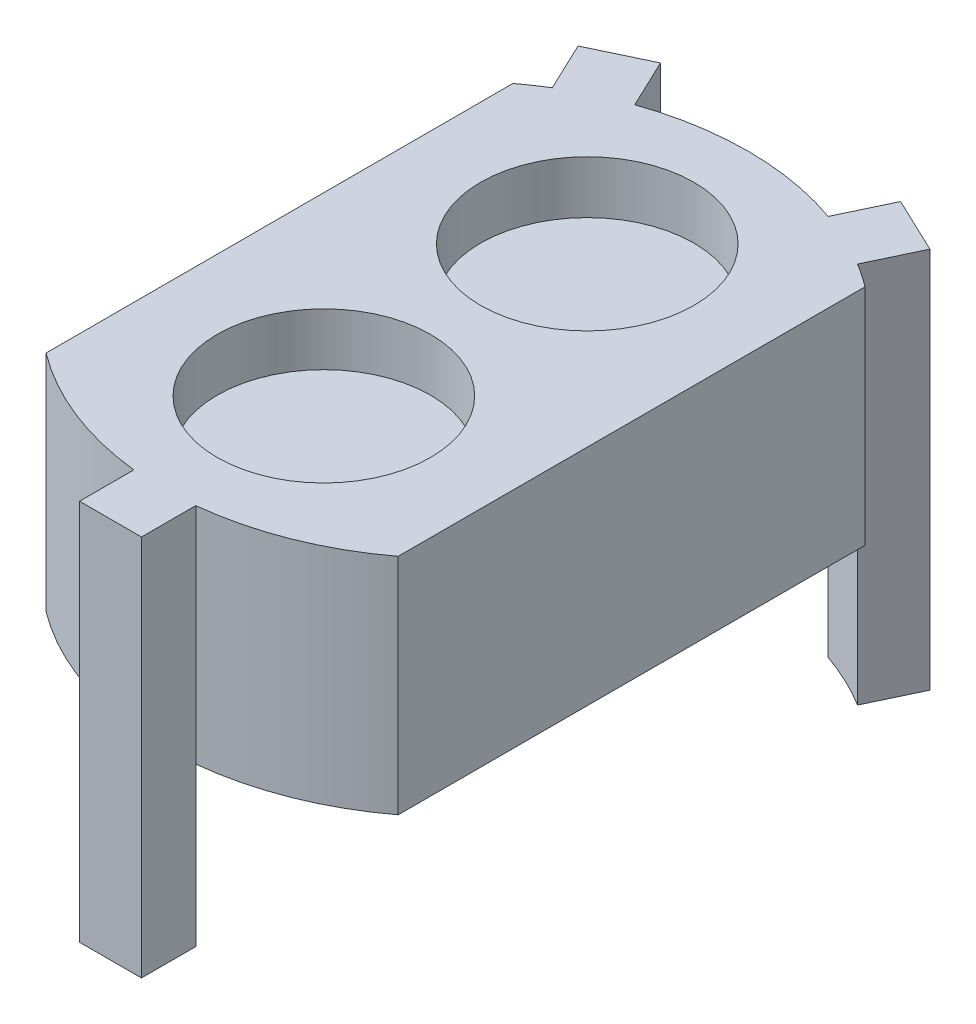
ISO-10303-21;
HEADER;
FILE_DESCRIPTION(('STEP AP214'),'2;1');
FILE_NAME('part.step','',(''),(''),'','','');
FILE_SCHEMA(('AUTOMOTIVE_DESIGN { 1 0 10303 214 1 1 1 1 }'));
ENDSEC;
DATA;
#1=APPLICATION_CONTEXT('core data for automotive mechanical design processes');
#2=APPLICATION_PROTOCOL_DEFINITION('international standard','automotive_design',2000,#1);
#3=PRODUCT_CONTEXT('',#1,'mechanical');
#4=PRODUCT('Part','Part','',(#3));
#5=PRODUCT_RELATED_PRODUCT_CATEGORY('part','',(#4));
#6=PRODUCT_DEFINITION_FORMATION('','',#4);
#7=PRODUCT_DEFINITION_CONTEXT('part definition',#1,'design');
#8=PRODUCT_DEFINITION('design','',#6,#7);
#9=PRODUCT_DEFINITION_SHAPE('','',#8);
#10=(LENGTH_UNIT() NAMED_UNIT(*) SI_UNIT(.MILLI.,.METRE.));
#11=(NAMED_UNIT(*) PLANE_ANGLE_UNIT() SI_UNIT($,.RADIAN.));
#12=(NAMED_UNIT(*) SI_UNIT($,.STERADIAN.) SOLID_ANGLE_UNIT());
#13=UNCERTAINTY_MEASURE_WITH_UNIT(LENGTH_MEASURE(1.E-05),#10,'distance_accuracy_value','');
#14=(GEOMETRIC_REPRESENTATION_CONTEXT(3) GLOBAL_UNCERTAINTY_ASSIGNED_CONTEXT((#13)) GLOBAL_UNIT_ASSIGNED_CONTEXT((#10,
#11,#12)) REPRESENTATION_CONTEXT('',''));
#15=CARTESIAN_POINT('',(0.,0.,0.));
#16=DIRECTION('',(0.,0.,1.));
#17=DIRECTION('',(1.,0.,0.));
#18=AXIS2_PLACEMENT_3D('',#15,#16,#17);
#19=CARTESIAN_POINT('',(0.,14.5,0.));
#20=DIRECTION('',(0.,-1.,0.));
#21=DIRECTION('',(0.,0.,-1.));
#22=AXIS2_PLACEMENT_3D('',#19,#20,#21);
#23=CYLINDRICAL_SURFACE('',#22,11.1);
#24=DIRECTION('',(0.,-1.,0.));
#25=VECTOR('',#24,1.);
#26=CARTESIAN_POINT('',(-6.68413592838548,14.5,-8.86184669754935));
#27=LINE('',#26,#25);
#28=CARTESIAN_POINT('',(-6.68413592838549,14.5,-8.86184669754935));
#29=VERTEX_POINT('',#28);
#30=CARTESIAN_POINT('',(-6.68413592838549,6.,-8.86184669754935));
#31=VERTEX_POINT('',#30);
#32=EDGE_CURVE('E55',#29,#31,#27,.T.);
#33=ORIENTED_EDGE('',*,*,#32,.F.);
#34=CARTESIAN_POINT('',(0.,14.5,0.));
#35=DIRECTION('',(0.,1.,0.));
#36=DIRECTION('',(0.,0.,1.));
#37=AXIS2_PLACEMENT_3D('',#34,#35,#36);
#38=CIRCLE('',#37,11.1);
#39=CARTESIAN_POINT('',(-5.79473413949581,14.5,-9.46736796858355));
#40=VERTEX_POINT('',#39);
#41=EDGE_CURVE('E186',#40,#29,#38,.T.);
#42=ORIENTED_EDGE('',*,*,#41,.F.);
#43=DIRECTION('',(0.,-1.,0.));
#44=VECTOR('',#43,1.);
#45=CARTESIAN_POINT('',(-5.79473413949581,14.5,-9.46736796858355));
#46=LINE('',#45,#44);
#47=CARTESIAN_POINT('',(-5.79473413949581,6.,-9.46736796858355));
#48=VERTEX_POINT('',#47);
#49=EDGE_CURVE('E286',#40,#48,#46,.T.);
#50=ORIENTED_EDGE('',*,*,#49,.T.);
#51=CARTESIAN_POINT('',(0.,6.,0.));
#52=DIRECTION('',(0.,-1.,0.));
#53=DIRECTION('',(0.,0.,-1.));
#54=AXIS2_PLACEMENT_3D('',#51,#52,#53);
#55=CIRCLE('',#54,11.1);
#56=EDGE_CURVE('E362',#31,#48,#55,.T.);
#57=ORIENTED_EDGE('',*,*,#56,.F.);
#58=EDGE_LOOP('',(#33,#42,#50,#57));
#59=FACE_BOUND('',#58,.T.);
#60=ADVANCED_FACE('F39',(#59),#23,.T.);
#61=DIRECTION('',(0.,-1.,0.));
#62=VECTOR('',#61,1.);
#63=CARTESIAN_POINT('',(-6.68413592838548,14.5,8.86184669754936));
#64=LINE('',#63,#62);
#65=CARTESIAN_POINT('',(-6.68413592838548,6.,8.86184669754935));
#66=VERTEX_POINT('',#65);
#67=CARTESIAN_POINT('',(-6.68413592838548,14.5,8.86184669754936));
#68=VERTEX_POINT('',#67);
#69=EDGE_CURVE('E168',#66,#68,#64,.F.);
#70=ORIENTED_EDGE('',*,*,#69,.F.);
#71=CARTESIAN_POINT('',(-1.175,6.,11.0376344838919));
#72=VERTEX_POINT('',#71);
#73=EDGE_CURVE('E363',#72,#66,#55,.T.);
#74=ORIENTED_EDGE('',*,*,#73,.F.);
#75=DIRECTION('',(0.,-1.,0.));
#76=VECTOR('',#75,1.);
#77=CARTESIAN_POINT('',(-1.175,14.5,11.0376344838919));
#78=LINE('',#77,#76);
#79=CARTESIAN_POINT('',(-1.175,14.5,11.0376344838919));
#80=VERTEX_POINT('',#79);
#81=EDGE_CURVE('E191',#80,#72,#78,.T.);
#82=ORIENTED_EDGE('',*,*,#81,.F.);
#83=EDGE_CURVE('E183',#68,#80,#38,.T.);
#84=ORIENTED_EDGE('',*,*,#83,.F.);
#85=EDGE_LOOP('',(#70,#74,#82,#84));
#86=FACE_BOUND('',#85,.T.);
#87=ADVANCED_FACE('F189',(#86),#23,.T.);
#88=CARTESIAN_POINT('',(0.,14.5,0.));
#89=DIRECTION('',(0.,-1.,0.));
#90=DIRECTION('',(0.,0.,-1.));
#91=AXIS2_PLACEMENT_3D('',#88,#89,#90);
#92=CYLINDRICAL_SURFACE('',#91,11.1);
#93=DIRECTION('',(0.,-1.,0.));
#94=VECTOR('',#93,1.);
#95=CARTESIAN_POINT('',(6.68413592838549,14.5,8.86184669754935));
#96=LINE('',#95,#94);
#97=CARTESIAN_POINT('',(6.68413592838549,14.5,8.86184669754935));
#98=VERTEX_POINT('',#97);
#99=CARTESIAN_POINT('',(6.68413592838549,6.,8.86184669754935));
#100=VERTEX_POINT('',#99);
#101=EDGE_CURVE('E63',#98,#100,#96,.T.);
#102=ORIENTED_EDGE('',*,*,#101,.F.);
#103=CARTESIAN_POINT('',(0.,14.5,0.));
#104=DIRECTION('',(0.,1.,0.));
#105=DIRECTION('',(0.,0.,1.));
#106=AXIS2_PLACEMENT_3D('',#103,#104,#105);
#107=CIRCLE('',#106,11.1);
#108=CARTESIAN_POINT('',(1.175,14.5,11.0376344838919));
#109=VERTEX_POINT('',#108);
#110=EDGE_CURVE('E212',#109,#98,#107,.T.);
#111=ORIENTED_EDGE('',*,*,#110,.F.);
#112=DIRECTION('',(0.,-1.,0.));
#113=VECTOR('',#112,1.);
#114=CARTESIAN_POINT('',(1.175,14.5,11.0376344838919));
#115=LINE('',#114,#113);
#116=CARTESIAN_POINT('',(1.175,6.,11.0376344838919));
#117=VERTEX_POINT('',#116);
#118=EDGE_CURVE('E272',#109,#117,#115,.T.);
#119=ORIENTED_EDGE('',*,*,#118,.T.);
#120=EDGE_CURVE('E359',#100,#117,#55,.T.);
#121=ORIENTED_EDGE('',*,*,#120,.F.);
#122=EDGE_LOOP('',(#102,#111,#119,#121));
#123=FACE_BOUND('',#122,.T.);
#124=ADVANCED_FACE('F417',(#123),#92,.T.);
#125=DIRECTION('',(0.,-1.,0.));
#126=VECTOR('',#125,1.);
#127=CARTESIAN_POINT('',(6.68413592838548,14.5,-8.86184669754935));
#128=LINE('',#127,#126);
#129=CARTESIAN_POINT('',(6.68413592838548,6.,-8.86184669754935));
#130=VERTEX_POINT('',#129);
#131=CARTESIAN_POINT('',(6.68413592838548,14.5,-8.86184669754936));
#132=VERTEX_POINT('',#131);
#133=EDGE_CURVE('E420',#130,#132,#128,.F.);
#134=ORIENTED_EDGE('',*,*,#133,.F.);
#135=CARTESIAN_POINT('',(5.79473413949582,6.,-9.46736796858355));
#136=VERTEX_POINT('',#135);
#137=EDGE_CURVE('E369',#136,#130,#55,.T.);
#138=ORIENTED_EDGE('',*,*,#137,.F.);
#139=DIRECTION('',(0.,-1.,0.));
#140=VECTOR('',#139,1.);
#141=CARTESIAN_POINT('',(5.79473413949582,14.5,-9.46736796858355));
#142=LINE('',#141,#140);
#143=CARTESIAN_POINT('',(5.79473413949582,14.5,-9.46736796858355));
#144=VERTEX_POINT('',#143);
#145=EDGE_CURVE('E268',#144,#136,#142,.T.);
#146=ORIENTED_EDGE('',*,*,#145,.F.);
#147=EDGE_CURVE('E211',#132,#144,#107,.T.);
#148=ORIENTED_EDGE('',*,*,#147,.F.);
#149=EDGE_LOOP('',(#134,#138,#146,#148));
#150=FACE_BOUND('',#149,.T.);
#151=ADVANCED_FACE('F451',(#150),#92,.T.);
#152=CARTESIAN_POINT('',(0.,14.5,0.));
#153=DIRECTION('',(0.,1.,0.));
#154=DIRECTION('',(0.,0.,1.));
#155=AXIS2_PLACEMENT_3D('',#152,#153,#154);
#156=PLANE('',#155);
#157=CARTESIAN_POINT('',(0.,14.5,-5.));
#158=DIRECTION('',(0.,1.,0.));
#159=DIRECTION('',(0.,0.,1.));
#160=AXIS2_PLACEMENT_3D('',#157,#158,#159);
#161=CIRCLE('',#160,4.05);
#162=CARTESIAN_POINT('',(0.,14.5,-0.95));
#163=VERTEX_POINT('',#162);
#164=EDGE_CURVE('E432',#163,#163,#161,.T.);
#165=ORIENTED_EDGE('',*,*,#164,.F.);
#166=EDGE_LOOP('',(#165));
#167=FACE_BOUND('',#166,.T.);
#168=CARTESIAN_POINT('',(0.,14.5,5.));
#169=DIRECTION('',(0.,1.,0.));
#170=DIRECTION('',(0.,0.,1.));
#171=AXIS2_PLACEMENT_3D('',#168,#169,#170);
#172=CIRCLE('',#171,4.05);
#173=CARTESIAN_POINT('',(0.,14.5,9.05));
#174=VERTEX_POINT('',#173);
#175=EDGE_CURVE('E419',#174,#174,#172,.T.);
#176=ORIENTED_EDGE('',*,*,#175,.F.);
#177=EDGE_LOOP('',(#176));
#178=FACE_BOUND('',#177,.T.);
#179=ORIENTED_EDGE('',*,*,#110,.T.);
#180=DIRECTION('',(0.,0.,1.));
#181=VECTOR('',#180,1.);
#182=CARTESIAN_POINT('',(6.68413592838548,14.5,-11.1));
#183=LINE('',#182,#181);
#184=EDGE_CURVE('E177',#132,#98,#183,.T.);
#185=ORIENTED_EDGE('',*,*,#184,.F.);
#186=ORIENTED_EDGE('',*,*,#147,.T.);
#187=DIRECTION('',(0.428828828828823,0.,-0.903385762321557));
#188=VECTOR('',#187,1.);
#189=CARTESIAN_POINT('',(6.67913592838539,14.5,-11.3304796125385));
#190=LINE('',#189,#188);
#191=CARTESIAN_POINT('',(6.67913592838539,14.5,-11.3304796125385));
#192=VERTEX_POINT('',#191);
#193=EDGE_CURVE('E215',#144,#192,#190,.T.);
#194=ORIENTED_EDGE('',*,*,#193,.T.);
#195=DIRECTION('',(-0.903385762321554,0.,-0.428828828828829));
#196=VECTOR('',#195,1.);
#197=CARTESIAN_POINT('',(4.55617938692977,14.5,-12.3382273602863));
#198=LINE('',#197,#196);
#199=CARTESIAN_POINT('',(4.55617938692977,14.5,-12.3382273602863));
#200=VERTEX_POINT('',#199);
#201=EDGE_CURVE('E218',#192,#200,#198,.T.);
#202=ORIENTED_EDGE('',*,*,#201,.T.);
#203=DIRECTION('',(-0.428828828828829,0.,0.903385762321554));
#204=VECTOR('',#203,1.);
#205=CARTESIAN_POINT('',(3.67177759804017,14.5,-10.4751157163313));
#206=LINE('',#205,#204);
#207=CARTESIAN_POINT('',(3.67177759804017,14.5,-10.4751157163313));
#208=VERTEX_POINT('',#207);
#209=EDGE_CURVE('E221',#200,#208,#206,.T.);
#210=ORIENTED_EDGE('',*,*,#209,.T.);
#211=CARTESIAN_POINT('',(0.,14.5,0.));
#212=DIRECTION('',(0.,1.,0.));
#213=DIRECTION('',(0.,0.,1.));
#214=AXIS2_PLACEMENT_3D('',#211,#212,#213);
#215=CIRCLE('',#214,11.1);
#216=CARTESIAN_POINT('',(-3.67177759804019,14.5,-10.4751157163313));
#217=VERTEX_POINT('',#216);
#218=EDGE_CURVE('E256',#208,#217,#215,.T.);
#219=ORIENTED_EDGE('',*,*,#218,.T.);
#220=DIRECTION('',(-0.428828828828824,0.,-0.903385762321556));
#221=VECTOR('',#220,1.);
#222=CARTESIAN_POINT('',(-4.55617938692977,14.5,-12.3382273602863));
#223=LINE('',#222,#221);
#224=CARTESIAN_POINT('',(-4.55617938692977,14.5,-12.3382273602863));
#225=VERTEX_POINT('',#224);
#226=EDGE_CURVE('E331',#217,#225,#223,.T.);
#227=ORIENTED_EDGE('',*,*,#226,.T.);
#228=DIRECTION('',(-0.903385762321553,0.,0.42882882882883));
#229=VECTOR('',#228,1.);
#230=CARTESIAN_POINT('',(-6.6791359283854,14.5,-11.3304796125385));
#231=LINE('',#230,#229);
#232=CARTESIAN_POINT('',(-6.6791359283854,14.5,-11.3304796125385));
#233=VERTEX_POINT('',#232);
#234=EDGE_CURVE('E199',#225,#233,#231,.T.);
#235=ORIENTED_EDGE('',*,*,#234,.T.);
#236=DIRECTION('',(0.42882882882883,0.,0.903385762321553));
#237=VECTOR('',#236,1.);
#238=CARTESIAN_POINT('',(-5.79473413949581,14.5,-9.46736796858355));
#239=LINE('',#238,#237);
#240=EDGE_CURVE('E194',#233,#40,#239,.T.);
#241=ORIENTED_EDGE('',*,*,#240,.T.);
#242=ORIENTED_EDGE('',*,*,#41,.T.);
#243=DIRECTION('',(0.,0.,-1.));
#244=VECTOR('',#243,1.);
#245=CARTESIAN_POINT('',(-6.68413592838549,14.5,-11.1));
#246=LINE('',#245,#244);
#247=EDGE_CURVE('E171',#68,#29,#246,.T.);
#248=ORIENTED_EDGE('',*,*,#247,.F.);
#249=ORIENTED_EDGE('',*,*,#83,.T.);
#250=DIRECTION('',(0.,0.,1.));
#251=VECTOR('',#250,1.);
#252=CARTESIAN_POINT('',(-1.175,14.5,13.1));
#253=LINE('',#252,#251);
#254=CARTESIAN_POINT('',(-1.175,14.5,13.1));
#255=VERTEX_POINT('',#254);
#256=EDGE_CURVE('E198',#80,#255,#253,.T.);
#257=ORIENTED_EDGE('',*,*,#256,.T.);
#258=DIRECTION('',(1.,0.,0.));
#259=VECTOR('',#258,1.);
#260=CARTESIAN_POINT('',(1.175,14.5,13.1));
#261=LINE('',#260,#259);
#262=CARTESIAN_POINT('',(1.175,14.5,13.1));
#263=VERTEX_POINT('',#262);
#264=EDGE_CURVE('E205',#255,#263,#261,.T.);
#265=ORIENTED_EDGE('',*,*,#264,.T.);
#266=DIRECTION('',(0.,0.,-1.));
#267=VECTOR('',#266,1.);
#268=CARTESIAN_POINT('',(1.175,14.5,11.0376344838919));
#269=LINE('',#268,#267);
#270=EDGE_CURVE('E208',#263,#109,#269,.T.);
#271=ORIENTED_EDGE('',*,*,#270,.T.);
#272=EDGE_LOOP('',(#179,#185,#186,#194,#202,#210,#219,#227,#235,#241,#242,#248,#249,#257,#265,#271));
#273=FACE_BOUND('',#272,.T.);
#274=ADVANCED_FACE('F182',(#167,#178,#273),#156,.T.);
#275=CARTESIAN_POINT('',(0.,6.,0.));
#276=DIRECTION('',(0.,-1.,0.));
#277=DIRECTION('',(0.,0.,-1.));
#278=AXIS2_PLACEMENT_3D('',#275,#276,#277);
#279=PLANE('',#278);
#280=ORIENTED_EDGE('',*,*,#137,.T.);
#281=DIRECTION('',(0.,0.,1.));
#282=VECTOR('',#281,1.);
#283=CARTESIAN_POINT('',(6.68413592838549,6.,0.));
#284=LINE('',#283,#282);
#285=EDGE_CURVE('E11',#130,#100,#284,.T.);
#286=ORIENTED_EDGE('',*,*,#285,.T.);
#287=ORIENTED_EDGE('',*,*,#120,.T.);
#288=EDGE_CURVE('E370',#117,#72,#55,.T.);
#289=ORIENTED_EDGE('',*,*,#288,.T.);
#290=ORIENTED_EDGE('',*,*,#73,.T.);
#291=DIRECTION('',(0.,0.,-1.));
#292=VECTOR('',#291,1.);
#293=CARTESIAN_POINT('',(-6.68413592838548,6.,0.));
#294=LINE('',#293,#292);
#295=EDGE_CURVE('E48',#66,#31,#294,.T.);
#296=ORIENTED_EDGE('',*,*,#295,.T.);
#297=ORIENTED_EDGE('',*,*,#56,.T.);
#298=CARTESIAN_POINT('',(-3.67177759804019,6.,-10.4751157163313));
#299=VERTEX_POINT('',#298);
#300=EDGE_CURVE('E356',#48,#299,#55,.T.);
#301=ORIENTED_EDGE('',*,*,#300,.T.);
#302=CARTESIAN_POINT('',(3.67177759804017,6.,-10.4751157163313));
#303=VERTEX_POINT('',#302);
#304=EDGE_CURVE('E352',#299,#303,#55,.T.);
#305=ORIENTED_EDGE('',*,*,#304,.T.);
#306=EDGE_CURVE('E366',#303,#136,#55,.T.);
#307=ORIENTED_EDGE('',*,*,#306,.T.);
#308=EDGE_LOOP('',(#280,#286,#287,#289,#290,#296,#297,#301,#305,#307));
#309=FACE_BOUND('',#308,.T.);
#310=ADVANCED_FACE('F450',(#309),#279,.T.);
#311=CARTESIAN_POINT('',(0.,14.5,0.));
#312=DIRECTION('',(0.,-1.,0.));
#313=DIRECTION('',(0.,0.,-1.));
#314=AXIS2_PLACEMENT_3D('',#311,#312,#313);
#315=CYLINDRICAL_SURFACE('',#314,11.1);
#316=ORIENTED_EDGE('',*,*,#304,.F.);
#317=DIRECTION('',(0.,-1.,0.));
#318=VECTOR('',#317,1.);
#319=CARTESIAN_POINT('',(-3.67177759804019,14.5,-10.4751157163313));
#320=LINE('',#319,#318);
#321=EDGE_CURVE('E298',#217,#299,#320,.T.);
#322=ORIENTED_EDGE('',*,*,#321,.F.);
#323=ORIENTED_EDGE('',*,*,#218,.F.);
#324=DIRECTION('',(0.,-1.,0.));
#325=VECTOR('',#324,1.);
#326=CARTESIAN_POINT('',(3.67177759804017,14.5,-10.4751157163313));
#327=LINE('',#326,#325);
#328=EDGE_CURVE('E224',#208,#303,#327,.T.);
#329=ORIENTED_EDGE('',*,*,#328,.T.);
#330=EDGE_LOOP('',(#316,#322,#323,#329));
#331=FACE_BOUND('',#330,.T.);
#332=ADVANCED_FACE('F41',(#331),#315,.T.);
#333=CARTESIAN_POINT('',(0.,0.,0.));
#334=DIRECTION('',(0.,1.,0.));
#335=DIRECTION('',(0.,0.,1.));
#336=AXIS2_PLACEMENT_3D('',#333,#334,#335);
#337=PLANE('',#336);
#338=DIRECTION('',(0.428828828828823,0.,-0.903385762321557));
#339=VECTOR('',#338,1.);
#340=CARTESIAN_POINT('',(6.67913592838539,0.,-11.3304796125385));
#341=LINE('',#340,#339);
#342=CARTESIAN_POINT('',(5.79473413949581,0.,-9.46736796858354));
#343=VERTEX_POINT('',#342);
#344=CARTESIAN_POINT('',(6.67913592838539,0.,-11.3304796125385));
#345=VERTEX_POINT('',#344);
#346=EDGE_CURVE('E246',#343,#345,#341,.T.);
#347=ORIENTED_EDGE('',*,*,#346,.F.);
#348=CARTESIAN_POINT('',(0.,0.,0.));
#349=DIRECTION('',(0.,-1.,0.));
#350=DIRECTION('',(0.,0.,-1.));
#351=AXIS2_PLACEMENT_3D('',#348,#349,#350);
#352=CIRCLE('',#351,11.1);
#353=CARTESIAN_POINT('',(3.67177759804017,0.,-10.4751157163313));
#354=VERTEX_POINT('',#353);
#355=EDGE_CURVE('E357',#354,#343,#352,.T.);
#356=ORIENTED_EDGE('',*,*,#355,.F.);
#357=DIRECTION('',(-0.428828828828829,0.,0.903385762321554));
#358=VECTOR('',#357,1.);
#359=CARTESIAN_POINT('',(3.67177759804017,0.,-10.4751157163313));
#360=LINE('',#359,#358);
#361=CARTESIAN_POINT('',(4.55617938692977,0.,-12.3382273602863));
#362=VERTEX_POINT('',#361);
#363=EDGE_CURVE('E252',#362,#354,#360,.T.);
#364=ORIENTED_EDGE('',*,*,#363,.F.);
#365=DIRECTION('',(-0.903385762321554,0.,-0.428828828828829));
#366=VECTOR('',#365,1.);
#367=CARTESIAN_POINT('',(4.55617938692977,0.,-12.3382273602863));
#368=LINE('',#367,#366);
#369=EDGE_CURVE('E249',#345,#362,#368,.T.);
#370=ORIENTED_EDGE('',*,*,#369,.F.);
#371=EDGE_LOOP('',(#347,#356,#364,#370));
#372=FACE_BOUND('',#371,.T.);
#373=ADVANCED_FACE('F480',(#372),#337,.F.);
#374=DIRECTION('',(-0.428828828828824,0.,-0.903385762321556));
#375=VECTOR('',#374,1.);
#376=CARTESIAN_POINT('',(-4.55617938692977,0.,-12.3382273602863));
#377=LINE('',#376,#375);
#378=CARTESIAN_POINT('',(-3.67177759804019,0.,-10.4751157163313));
#379=VERTEX_POINT('',#378);
#380=CARTESIAN_POINT('',(-4.55617938692977,0.,-12.3382273602863));
#381=VERTEX_POINT('',#380);
#382=EDGE_CURVE('E225',#379,#381,#377,.T.);
#383=ORIENTED_EDGE('',*,*,#382,.F.);
#384=CARTESIAN_POINT('',(0.,0.,0.));
#385=DIRECTION('',(0.,1.,0.));
#386=DIRECTION('',(0.,0.,1.));
#387=AXIS2_PLACEMENT_3D('',#384,#385,#386);
#388=CIRCLE('',#387,11.1);
#389=CARTESIAN_POINT('',(-5.79473413949581,0.,-9.46736796858355));
#390=VERTEX_POINT('',#389);
#391=EDGE_CURVE('E305',#379,#390,#388,.T.);
#392=ORIENTED_EDGE('',*,*,#391,.T.);
#393=DIRECTION('',(0.42882882882883,0.,0.903385762321553));
#394=VECTOR('',#393,1.);
#395=CARTESIAN_POINT('',(-5.79473413949581,0.,-9.46736796858355));
#396=LINE('',#395,#394);
#397=CARTESIAN_POINT('',(-6.6791359283854,0.,-11.3304796125385));
#398=VERTEX_POINT('',#397);
#399=EDGE_CURVE('E232',#398,#390,#396,.T.);
#400=ORIENTED_EDGE('',*,*,#399,.F.);
#401=DIRECTION('',(-0.903385762321553,0.,0.42882882882883));
#402=VECTOR('',#401,1.);
#403=CARTESIAN_POINT('',(-6.6791359283854,0.,-11.3304796125385));
#404=LINE('',#403,#402);
#405=EDGE_CURVE('E228',#381,#398,#404,.T.);
#406=ORIENTED_EDGE('',*,*,#405,.F.);
#407=EDGE_LOOP('',(#383,#392,#400,#406));
#408=FACE_BOUND('',#407,.T.);
#409=ADVANCED_FACE('F314',(#408),#337,.F.);
#410=CARTESIAN_POINT('',(-4.55617938692977,14.5,-12.3382273602863));
#411=DIRECTION('',(-0.903385762321556,0.,0.428828828828823));
#412=DIRECTION('',(0.428828828828824,0.,0.903385762321557));
#413=AXIS2_PLACEMENT_3D('',#410,#411,#412);
#414=PLANE('',#413);
#415=ORIENTED_EDGE('',*,*,#382,.T.);
#416=DIRECTION('',(0.,-1.,0.));
#417=VECTOR('',#416,1.);
#418=CARTESIAN_POINT('',(-4.55617938692977,14.5,-12.3382273602863));
#419=LINE('',#418,#417);
#420=EDGE_CURVE('E294',#225,#381,#419,.T.);
#421=ORIENTED_EDGE('',*,*,#420,.F.);
#422=ORIENTED_EDGE('',*,*,#226,.F.);
#423=ORIENTED_EDGE('',*,*,#321,.T.);
#424=DIRECTION('',(0.,-1.,0.));
#425=VECTOR('',#424,1.);
#426=CARTESIAN_POINT('',(-3.67177759804019,6.,-10.4751157163313));
#427=LINE('',#426,#425);
#428=EDGE_CURVE('E229',#299,#379,#427,.T.);
#429=ORIENTED_EDGE('',*,*,#428,.T.);
#430=EDGE_LOOP('',(#415,#421,#422,#423,#429));
#431=FACE_BOUND('',#430,.T.);
#432=ADVANCED_FACE('F330',(#431),#414,.F.);
#433=CARTESIAN_POINT('',(-6.6791359283854,14.5,-11.3304796125385));
#434=DIRECTION('',(0.42882882882883,0.,0.903385762321553));
#435=DIRECTION('',(0.903385762321553,0.,-0.42882882882883));
#436=AXIS2_PLACEMENT_3D('',#433,#434,#435);
#437=PLANE('',#436);
#438=ORIENTED_EDGE('',*,*,#405,.T.);
#439=DIRECTION('',(0.,-1.,0.));
#440=VECTOR('',#439,1.);
#441=CARTESIAN_POINT('',(-6.6791359283854,14.5,-11.3304796125385));
#442=LINE('',#441,#440);
#443=EDGE_CURVE('E290',#233,#398,#442,.T.);
#444=ORIENTED_EDGE('',*,*,#443,.F.);
#445=ORIENTED_EDGE('',*,*,#234,.F.);
#446=ORIENTED_EDGE('',*,*,#420,.T.);
#447=EDGE_LOOP('',(#438,#444,#445,#446));
#448=FACE_BOUND('',#447,.T.);
#449=ADVANCED_FACE('F327',(#448),#437,.F.);
#450=CARTESIAN_POINT('',(-5.79473413949581,14.5,-9.46736796858355));
#451=DIRECTION('',(0.903385762321553,0.,-0.42882882882883));
#452=DIRECTION('',(-0.42882882882883,0.,-0.903385762321553));
#453=AXIS2_PLACEMENT_3D('',#450,#451,#452);
#454=PLANE('',#453);
#455=ORIENTED_EDGE('',*,*,#399,.T.);
#456=DIRECTION('',(0.,-1.,0.));
#457=VECTOR('',#456,1.);
#458=CARTESIAN_POINT('',(-5.79473413949581,6.,-9.46736796858355));
#459=LINE('',#458,#457);
#460=EDGE_CURVE('E322',#390,#48,#459,.F.);
#461=ORIENTED_EDGE('',*,*,#460,.T.);
#462=ORIENTED_EDGE('',*,*,#49,.F.);
#463=ORIENTED_EDGE('',*,*,#240,.F.);
#464=ORIENTED_EDGE('',*,*,#443,.T.);
#465=EDGE_LOOP('',(#455,#461,#462,#463,#464));
#466=FACE_BOUND('',#465,.T.);
#467=ADVANCED_FACE('F320',(#466),#454,.F.);
#468=CARTESIAN_POINT('',(-1.175,14.5,13.1));
#469=DIRECTION('',(1.,0.,0.));
#470=DIRECTION('',(0.,0.,-1.));
#471=AXIS2_PLACEMENT_3D('',#468,#469,#470);
#472=PLANE('',#471);
#473=DIRECTION('',(0.,0.,1.));
#474=VECTOR('',#473,1.);
#475=CARTESIAN_POINT('',(-1.175,0.,13.1));
#476=LINE('',#475,#474);
#477=CARTESIAN_POINT('',(-1.175,0.,11.0376344838919));
#478=VERTEX_POINT('',#477);
#479=CARTESIAN_POINT('',(-1.175,0.,13.1));
#480=VERTEX_POINT('',#479);
#481=EDGE_CURVE('E236',#478,#480,#476,.T.);
#482=ORIENTED_EDGE('',*,*,#481,.T.);
#483=DIRECTION('',(0.,-1.,0.));
#484=VECTOR('',#483,1.);
#485=CARTESIAN_POINT('',(-1.175,14.5,13.1));
#486=LINE('',#485,#484);
#487=EDGE_CURVE('E280',#255,#480,#486,.T.);
#488=ORIENTED_EDGE('',*,*,#487,.F.);
#489=ORIENTED_EDGE('',*,*,#256,.F.);
#490=ORIENTED_EDGE('',*,*,#81,.T.);
#491=DIRECTION('',(0.,-1.,0.));
#492=VECTOR('',#491,1.);
#493=CARTESIAN_POINT('',(-1.175,6.,11.0376344838919));
#494=LINE('',#493,#492);
#495=EDGE_CURVE('E339',#72,#478,#494,.T.);
#496=ORIENTED_EDGE('',*,*,#495,.T.);
#497=EDGE_LOOP('',(#482,#488,#489,#490,#496));
#498=FACE_BOUND('',#497,.T.);
#499=ADVANCED_FACE('F398',(#498),#472,.F.);
#500=CARTESIAN_POINT('',(1.175,14.5,13.1));
#501=DIRECTION('',(0.,0.,-1.));
#502=DIRECTION('',(-1.,0.,0.));
#503=AXIS2_PLACEMENT_3D('',#500,#501,#502);
#504=PLANE('',#503);
#505=DIRECTION('',(1.,0.,0.));
#506=VECTOR('',#505,1.);
#507=CARTESIAN_POINT('',(1.175,0.,13.1));
#508=LINE('',#507,#506);
#509=CARTESIAN_POINT('',(1.175,0.,13.1));
#510=VERTEX_POINT('',#509);
#511=EDGE_CURVE('E239',#480,#510,#508,.T.);
#512=ORIENTED_EDGE('',*,*,#511,.T.);
#513=DIRECTION('',(0.,-1.,0.));
#514=VECTOR('',#513,1.);
#515=CARTESIAN_POINT('',(1.175,14.5,13.1));
#516=LINE('',#515,#514);
#517=EDGE_CURVE('E276',#263,#510,#516,.T.);
#518=ORIENTED_EDGE('',*,*,#517,.F.);
#519=ORIENTED_EDGE('',*,*,#264,.F.);
#520=ORIENTED_EDGE('',*,*,#487,.T.);
#521=EDGE_LOOP('',(#512,#518,#519,#520));
#522=FACE_BOUND('',#521,.T.);
#523=ADVANCED_FACE('F407',(#522),#504,.F.);
#524=CARTESIAN_POINT('',(1.175,14.5,11.0376344838919));
#525=DIRECTION('',(-1.,0.,0.));
#526=DIRECTION('',(0.,0.,1.));
#527=AXIS2_PLACEMENT_3D('',#524,#525,#526);
#528=PLANE('',#527);
#529=DIRECTION('',(0.,0.,-1.));
#530=VECTOR('',#529,1.);
#531=CARTESIAN_POINT('',(1.175,0.,11.0376344838919));
#532=LINE('',#531,#530);
#533=CARTESIAN_POINT('',(1.175,0.,11.0376344838919));
#534=VERTEX_POINT('',#533);
#535=EDGE_CURVE('E242',#510,#534,#532,.T.);
#536=ORIENTED_EDGE('',*,*,#535,.T.);
#537=DIRECTION('',(0.,-1.,0.));
#538=VECTOR('',#537,1.);
#539=CARTESIAN_POINT('',(1.175,6.,11.0376344838919));
#540=LINE('',#539,#538);
#541=EDGE_CURVE('E389',#534,#117,#540,.F.);
#542=ORIENTED_EDGE('',*,*,#541,.T.);
#543=ORIENTED_EDGE('',*,*,#118,.F.);
#544=ORIENTED_EDGE('',*,*,#270,.F.);
#545=ORIENTED_EDGE('',*,*,#517,.T.);
#546=EDGE_LOOP('',(#536,#542,#543,#544,#545));
#547=FACE_BOUND('',#546,.T.);
#548=ADVANCED_FACE('F411',(#547),#528,.F.);
#549=CARTESIAN_POINT('',(6.67913592838539,14.5,-11.3304796125385));
#550=DIRECTION('',(-0.903385762321556,0.,-0.428828828828823));
#551=DIRECTION('',(-0.428828828828823,0.,0.903385762321557));
#552=AXIS2_PLACEMENT_3D('',#549,#550,#551);
#553=PLANE('',#552);
#554=ORIENTED_EDGE('',*,*,#346,.T.);
#555=DIRECTION('',(0.,-1.,0.));
#556=VECTOR('',#555,1.);
#557=CARTESIAN_POINT('',(6.67913592838539,14.5,-11.3304796125385));
#558=LINE('',#557,#556);
#559=EDGE_CURVE('E264',#192,#345,#558,.T.);
#560=ORIENTED_EDGE('',*,*,#559,.F.);
#561=ORIENTED_EDGE('',*,*,#193,.F.);
#562=ORIENTED_EDGE('',*,*,#145,.T.);
#563=DIRECTION('',(0.,-1.,0.));
#564=VECTOR('',#563,1.);
#565=CARTESIAN_POINT('',(5.79473413949581,6.,-9.46736796858354));
#566=LINE('',#565,#564);
#567=EDGE_CURVE('E384',#136,#343,#566,.T.);
#568=ORIENTED_EDGE('',*,*,#567,.T.);
#569=EDGE_LOOP('',(#554,#560,#561,#562,#568));
#570=FACE_BOUND('',#569,.T.);
#571=ADVANCED_FACE('F498',(#570),#553,.F.);
#572=CARTESIAN_POINT('',(4.55617938692977,14.5,-12.3382273602863));
#573=DIRECTION('',(-0.428828828828829,0.,0.903385762321554));
#574=DIRECTION('',(0.903385762321554,0.,0.428828828828829));
#575=AXIS2_PLACEMENT_3D('',#572,#573,#574);
#576=PLANE('',#575);
#577=ORIENTED_EDGE('',*,*,#369,.T.);
#578=DIRECTION('',(0.,-1.,0.));
#579=VECTOR('',#578,1.);
#580=CARTESIAN_POINT('',(4.55617938692977,14.5,-12.3382273602863));
#581=LINE('',#580,#579);
#582=EDGE_CURVE('E260',#200,#362,#581,.T.);
#583=ORIENTED_EDGE('',*,*,#582,.F.);
#584=ORIENTED_EDGE('',*,*,#201,.F.);
#585=ORIENTED_EDGE('',*,*,#559,.T.);
#586=EDGE_LOOP('',(#577,#583,#584,#585));
#587=FACE_BOUND('',#586,.T.);
#588=ADVANCED_FACE('F494',(#587),#576,.F.);
#589=CARTESIAN_POINT('',(3.67177759804017,14.5,-10.4751157163313));
#590=DIRECTION('',(0.903385762321554,0.,0.428828828828829));
#591=DIRECTION('',(0.428828828828829,0.,-0.903385762321554));
#592=AXIS2_PLACEMENT_3D('',#589,#590,#591);
#593=PLANE('',#592);
#594=ORIENTED_EDGE('',*,*,#363,.T.);
#595=DIRECTION('',(0.,-1.,0.));
#596=VECTOR('',#595,1.);
#597=CARTESIAN_POINT('',(3.67177759804017,6.,-10.4751157163313));
#598=LINE('',#597,#596);
#599=EDGE_CURVE('E380',#354,#303,#598,.F.);
#600=ORIENTED_EDGE('',*,*,#599,.T.);
#601=ORIENTED_EDGE('',*,*,#328,.F.);
#602=ORIENTED_EDGE('',*,*,#209,.F.);
#603=ORIENTED_EDGE('',*,*,#582,.T.);
#604=EDGE_LOOP('',(#594,#600,#601,#602,#603));
#605=FACE_BOUND('',#604,.T.);
#606=ADVANCED_FACE('F488',(#605),#593,.F.);
#607=ORIENTED_EDGE('',*,*,#481,.F.);
#608=EDGE_CURVE('E302',#478,#534,#388,.T.);
#609=ORIENTED_EDGE('',*,*,#608,.T.);
#610=ORIENTED_EDGE('',*,*,#535,.F.);
#611=ORIENTED_EDGE('',*,*,#511,.F.);
#612=EDGE_LOOP('',(#607,#609,#610,#611));
#613=FACE_BOUND('',#612,.T.);
#614=ADVANCED_FACE('F403',(#613),#337,.F.);
#615=CARTESIAN_POINT('',(0.,6.,0.));
#616=DIRECTION('',(0.,-1.,0.));
#617=DIRECTION('',(0.,0.,-1.));
#618=AXIS2_PLACEMENT_3D('',#615,#616,#617);
#619=CYLINDRICAL_SURFACE('',#618,11.1);
#620=ORIENTED_EDGE('',*,*,#300,.F.);
#621=ORIENTED_EDGE('',*,*,#460,.F.);
#622=ORIENTED_EDGE('',*,*,#391,.F.);
#623=ORIENTED_EDGE('',*,*,#428,.F.);
#624=EDGE_LOOP('',(#620,#621,#622,#623));
#625=FACE_BOUND('',#624,.T.);
#626=ADVANCED_FACE('F487',(#625),#619,.F.);
#627=ORIENTED_EDGE('',*,*,#288,.F.);
#628=ORIENTED_EDGE('',*,*,#541,.F.);
#629=ORIENTED_EDGE('',*,*,#608,.F.);
#630=ORIENTED_EDGE('',*,*,#495,.F.);
#631=EDGE_LOOP('',(#627,#628,#629,#630));
#632=FACE_BOUND('',#631,.T.);
#633=ADVANCED_FACE('F493',(#632),#619,.F.);
#634=ORIENTED_EDGE('',*,*,#306,.F.);
#635=ORIENTED_EDGE('',*,*,#599,.F.);
#636=ORIENTED_EDGE('',*,*,#355,.T.);
#637=ORIENTED_EDGE('',*,*,#567,.F.);
#638=EDGE_LOOP('',(#634,#635,#636,#637));
#639=FACE_BOUND('',#638,.T.);
#640=ADVANCED_FACE('F445',(#639),#619,.F.);
#641=CARTESIAN_POINT('',(0.,12.5,5.));
#642=DIRECTION('',(0.,1.,0.));
#643=DIRECTION('',(0.,0.,1.));
#644=AXIS2_PLACEMENT_3D('',#641,#642,#643);
#645=CYLINDRICAL_SURFACE('',#644,4.05);
#646=CARTESIAN_POINT('',(0.,12.5,5.));
#647=DIRECTION('',(0.,1.,0.));
#648=DIRECTION('',(0.,0.,1.));
#649=AXIS2_PLACEMENT_3D('',#646,#647,#648);
#650=CIRCLE('',#649,4.05);
#651=CARTESIAN_POINT('',(0.,12.5,9.05));
#652=VERTEX_POINT('',#651);
#653=EDGE_CURVE('E425',#652,#652,#650,.T.);
#654=ORIENTED_EDGE('',*,*,#653,.F.);
#655=EDGE_LOOP('',(#654));
#656=FACE_BOUND('',#655,.T.);
#657=ORIENTED_EDGE('',*,*,#175,.T.);
#658=EDGE_LOOP('',(#657));
#659=FACE_BOUND('',#658,.T.);
#660=ADVANCED_FACE('F442',(#656,#659),#645,.F.);
#661=CARTESIAN_POINT('',(0.,12.5,5.));
#662=DIRECTION('',(0.,1.,0.));
#663=DIRECTION('',(0.,0.,1.));
#664=AXIS2_PLACEMENT_3D('',#661,#662,#663);
#665=PLANE('',#664);
#666=ORIENTED_EDGE('',*,*,#653,.T.);
#667=EDGE_LOOP('',(#666));
#668=FACE_BOUND('',#667,.T.);
#669=ADVANCED_FACE('F440',(#668),#665,.T.);
#670=CARTESIAN_POINT('',(0.,12.5,-5.));
#671=DIRECTION('',(0.,1.,0.));
#672=DIRECTION('',(0.,0.,1.));
#673=AXIS2_PLACEMENT_3D('',#670,#671,#672);
#674=CYLINDRICAL_SURFACE('',#673,4.05);
#675=CARTESIAN_POINT('',(0.,12.5,-5.));
#676=DIRECTION('',(0.,1.,0.));
#677=DIRECTION('',(0.,0.,1.));
#678=AXIS2_PLACEMENT_3D('',#675,#676,#677);
#679=CIRCLE('',#678,4.05);
#680=CARTESIAN_POINT('',(0.,12.5,-0.95));
#681=VERTEX_POINT('',#680);
#682=EDGE_CURVE('E364',#681,#681,#679,.T.);
#683=ORIENTED_EDGE('',*,*,#682,.F.);
#684=EDGE_LOOP('',(#683));
#685=FACE_BOUND('',#684,.T.);
#686=ORIENTED_EDGE('',*,*,#164,.T.);
#687=EDGE_LOOP('',(#686));
#688=FACE_BOUND('',#687,.T.);
#689=ADVANCED_FACE('F608',(#685,#688),#674,.F.);
#690=CARTESIAN_POINT('',(0.,12.5,-5.));
#691=DIRECTION('',(0.,1.,0.));
#692=DIRECTION('',(0.,0.,1.));
#693=AXIS2_PLACEMENT_3D('',#690,#691,#692);
#694=PLANE('',#693);
#695=ORIENTED_EDGE('',*,*,#682,.T.);
#696=EDGE_LOOP('',(#695));
#697=FACE_BOUND('',#696,.T.);
#698=ADVANCED_FACE('F617',(#697),#694,.T.);
#699=CARTESIAN_POINT('',(-6.68413592838549,14.5,-11.1));
#700=DIRECTION('',(-1.,0.,0.));
#701=DIRECTION('',(0.,0.,1.));
#702=AXIS2_PLACEMENT_3D('',#699,#700,#701);
#703=PLANE('',#702);
#704=ORIENTED_EDGE('',*,*,#32,.T.);
#705=ORIENTED_EDGE('',*,*,#295,.F.);
#706=ORIENTED_EDGE('',*,*,#69,.T.);
#707=ORIENTED_EDGE('',*,*,#247,.T.);
#708=EDGE_LOOP('',(#704,#705,#706,#707));
#709=FACE_BOUND('',#708,.T.);
#710=ADVANCED_FACE('F170',(#709),#703,.T.);
#711=CARTESIAN_POINT('',(6.68413592838548,14.5,-11.1));
#712=DIRECTION('',(1.,0.,0.));
#713=DIRECTION('',(0.,0.,-1.));
#714=AXIS2_PLACEMENT_3D('',#711,#712,#713);
#715=PLANE('',#714);
#716=ORIENTED_EDGE('',*,*,#101,.T.);
#717=ORIENTED_EDGE('',*,*,#285,.F.);
#718=ORIENTED_EDGE('',*,*,#133,.T.);
#719=ORIENTED_EDGE('',*,*,#184,.T.);
#720=EDGE_LOOP('',(#716,#717,#718,#719));
#721=FACE_BOUND('',#720,.T.);
#722=ADVANCED_FACE('F668',(#721),#715,.T.);
#723=CLOSED_SHELL('',(#60,#87,#124,#151,#274,#310,#332,#373,#409,#432,#449,#467,#499,#523,#548,
#571,#588,#606,#614,#626,#633,#640,#660,#669,#689,#698,#710,#722));
#724=MANIFOLD_SOLID_BREP('B2',#723);
#725=ADVANCED_BREP_SHAPE_REPRESENTATION('',(#18,#724),#14);
#726=SHAPE_DEFINITION_REPRESENTATION(#9,#725);
ENDSEC;
END-ISO-10303-21;
